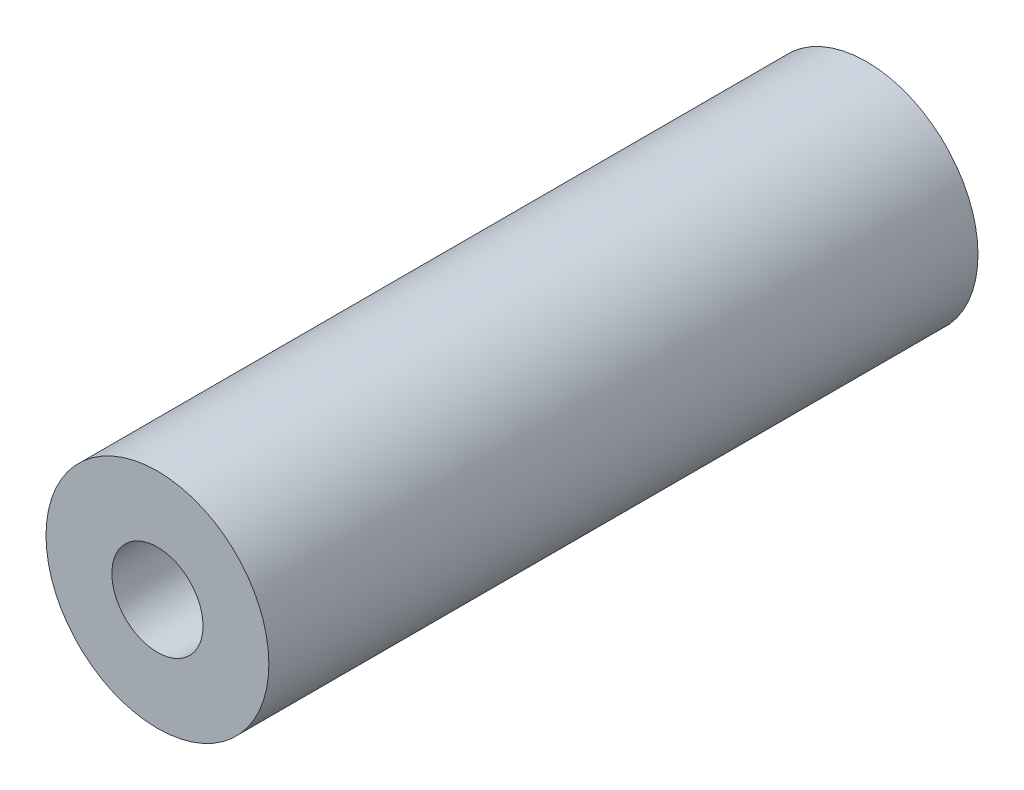
ISO-10303-21;
HEADER;
FILE_DESCRIPTION(('STEP AP214'),'2;1');
FILE_NAME('part.step','',(''),(''),'','','');
FILE_SCHEMA(('AUTOMOTIVE_DESIGN { 1 0 10303 214 1 1 1 1 }'));
ENDSEC;
DATA;
#1=APPLICATION_CONTEXT('core data for automotive mechanical design processes');
#2=APPLICATION_PROTOCOL_DEFINITION('international standard','automotive_design',2000,#1);
#3=PRODUCT_CONTEXT('',#1,'mechanical');
#4=PRODUCT('Part','Part','',(#3));
#5=PRODUCT_RELATED_PRODUCT_CATEGORY('part','',(#4));
#6=PRODUCT_DEFINITION_FORMATION('','',#4);
#7=PRODUCT_DEFINITION_CONTEXT('part definition',#1,'design');
#8=PRODUCT_DEFINITION('design','',#6,#7);
#9=PRODUCT_DEFINITION_SHAPE('','',#8);
#10=(LENGTH_UNIT() NAMED_UNIT(*) SI_UNIT(.MILLI.,.METRE.));
#11=(NAMED_UNIT(*) PLANE_ANGLE_UNIT() SI_UNIT($,.RADIAN.));
#12=(NAMED_UNIT(*) SI_UNIT($,.STERADIAN.) SOLID_ANGLE_UNIT());
#13=UNCERTAINTY_MEASURE_WITH_UNIT(LENGTH_MEASURE(1.E-05),#10,'distance_accuracy_value','');
#14=(GEOMETRIC_REPRESENTATION_CONTEXT(3) GLOBAL_UNCERTAINTY_ASSIGNED_CONTEXT((#13)) GLOBAL_UNIT_ASSIGNED_CONTEXT((#10,
#11,#12)) REPRESENTATION_CONTEXT('',''));
#15=CARTESIAN_POINT('',(0.,0.,0.));
#16=DIRECTION('',(0.,0.,1.));
#17=DIRECTION('',(1.,0.,0.));
#18=AXIS2_PLACEMENT_3D('',#15,#16,#17);
#19=CARTESIAN_POINT('',(0.,0.,35.));
#20=DIRECTION('',(0.,0.,1.));
#21=DIRECTION('',(1.,0.,0.));
#22=AXIS2_PLACEMENT_3D('',#19,#20,#21);
#23=PLANE('',#22);
#24=CARTESIAN_POINT('',(0.,0.,35.));
#25=DIRECTION('',(0.,0.,1.));
#26=DIRECTION('',(1.,0.,0.));
#27=AXIS2_PLACEMENT_3D('',#24,#25,#26);
#28=CIRCLE('',#27,5.5);
#29=CARTESIAN_POINT('',(5.5,0.,35.));
#30=VERTEX_POINT('',#29);
#31=EDGE_CURVE('E10',#30,#30,#28,.T.);
#32=ORIENTED_EDGE('',*,*,#31,.T.);
#33=EDGE_LOOP('',(#32));
#34=FACE_BOUND('',#33,.T.);
#35=CARTESIAN_POINT('',(0.,0.,35.));
#36=DIRECTION('',(0.,0.,1.));
#37=DIRECTION('',(1.,0.,0.));
#38=AXIS2_PLACEMENT_3D('',#35,#36,#37);
#39=CIRCLE('',#38,2.25);
#40=CARTESIAN_POINT('',(2.25,0.,35.));
#41=VERTEX_POINT('',#40);
#42=EDGE_CURVE('E43',#41,#41,#39,.T.);
#43=ORIENTED_EDGE('',*,*,#42,.F.);
#44=EDGE_LOOP('',(#43));
#45=FACE_BOUND('',#44,.T.);
#46=ADVANCED_FACE('F32',(#34,#45),#23,.T.);
#47=CARTESIAN_POINT('',(0.,0.,0.));
#48=DIRECTION('',(0.,0.,1.));
#49=DIRECTION('',(1.,0.,0.));
#50=AXIS2_PLACEMENT_3D('',#47,#48,#49);
#51=PLANE('',#50);
#52=CARTESIAN_POINT('',(0.,0.,0.));
#53=DIRECTION('',(0.,0.,1.));
#54=DIRECTION('',(1.,0.,0.));
#55=AXIS2_PLACEMENT_3D('',#52,#53,#54);
#56=CIRCLE('',#55,5.5);
#57=CARTESIAN_POINT('',(5.5,0.,0.));
#58=VERTEX_POINT('',#57);
#59=EDGE_CURVE('E36',#58,#58,#56,.T.);
#60=ORIENTED_EDGE('',*,*,#59,.F.);
#61=EDGE_LOOP('',(#60));
#62=FACE_BOUND('',#61,.T.);
#63=CARTESIAN_POINT('',(0.,0.,0.));
#64=DIRECTION('',(0.,0.,1.));
#65=DIRECTION('',(1.,0.,0.));
#66=AXIS2_PLACEMENT_3D('',#63,#64,#65);
#67=CIRCLE('',#66,2.25);
#68=CARTESIAN_POINT('',(2.25,0.,0.));
#69=VERTEX_POINT('',#68);
#70=EDGE_CURVE('E45',#69,#69,#67,.T.);
#71=ORIENTED_EDGE('',*,*,#70,.T.);
#72=EDGE_LOOP('',(#71));
#73=FACE_BOUND('',#72,.T.);
#74=ADVANCED_FACE('F55',(#62,#73),#51,.F.);
#75=CARTESIAN_POINT('',(0.,0.,35.));
#76=DIRECTION('',(0.,0.,-1.));
#77=DIRECTION('',(-1.,0.,0.));
#78=AXIS2_PLACEMENT_3D('',#75,#76,#77);
#79=CYLINDRICAL_SURFACE('',#78,5.5);
#80=ORIENTED_EDGE('',*,*,#31,.F.);
#81=EDGE_LOOP('',(#80));
#82=FACE_BOUND('',#81,.T.);
#83=ORIENTED_EDGE('',*,*,#59,.T.);
#84=EDGE_LOOP('',(#83));
#85=FACE_BOUND('',#84,.T.);
#86=ADVANCED_FACE('F34',(#82,#85),#79,.T.);
#87=CARTESIAN_POINT('',(0.,0.,35.));
#88=DIRECTION('',(0.,0.,-1.));
#89=DIRECTION('',(-1.,0.,0.));
#90=AXIS2_PLACEMENT_3D('',#87,#88,#89);
#91=CYLINDRICAL_SURFACE('',#90,2.25);
#92=ORIENTED_EDGE('',*,*,#42,.T.);
#93=EDGE_LOOP('',(#92));
#94=FACE_BOUND('',#93,.T.);
#95=ORIENTED_EDGE('',*,*,#70,.F.);
#96=EDGE_LOOP('',(#95));
#97=FACE_BOUND('',#96,.T.);
#98=ADVANCED_FACE('F51',(#94,#97),#91,.F.);
#99=CLOSED_SHELL('',(#46,#74,#86,#98));
#100=MANIFOLD_SOLID_BREP('B2',#99);
#101=ADVANCED_BREP_SHAPE_REPRESENTATION('',(#18,#100),#14);
#102=SHAPE_DEFINITION_REPRESENTATION(#9,#101);
ENDSEC;
END-ISO-10303-21;
